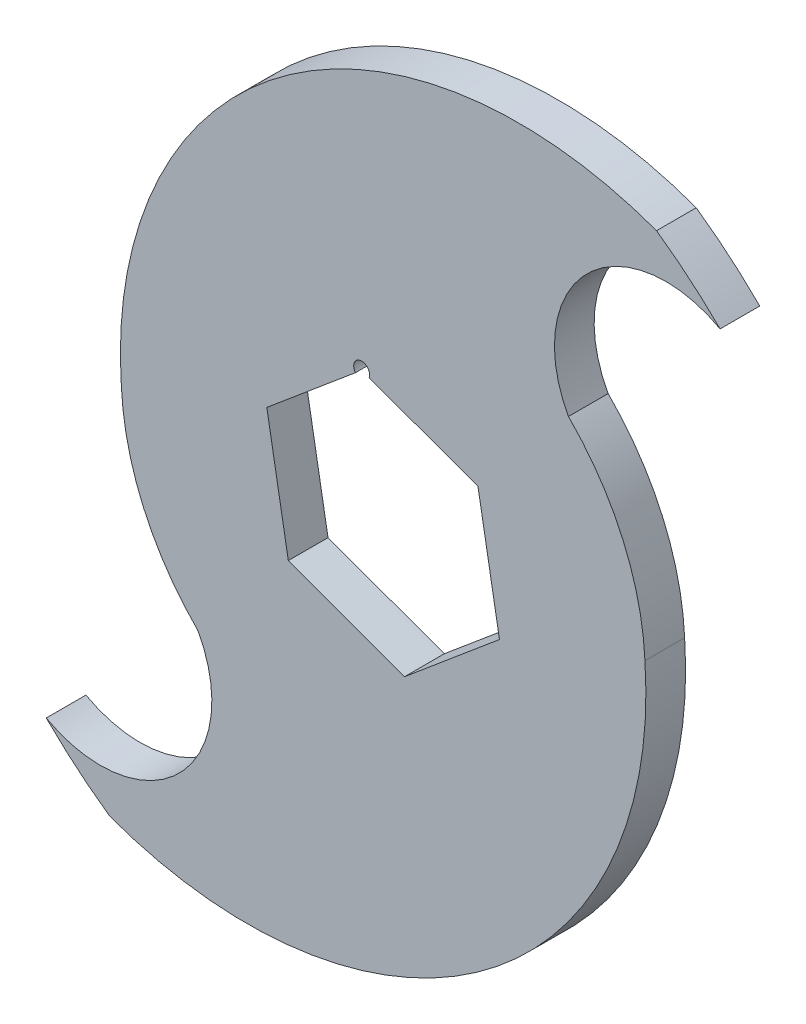
ISO-10303-21;
HEADER;
FILE_DESCRIPTION(('STEP AP214'),'2;1');
FILE_NAME('part.step','',(''),(''),'','','');
FILE_SCHEMA(('AUTOMOTIVE_DESIGN { 1 0 10303 214 1 1 1 1 }'));
ENDSEC;
DATA;
#1=APPLICATION_CONTEXT('core data for automotive mechanical design processes');
#2=APPLICATION_PROTOCOL_DEFINITION('international standard','automotive_design',2000,#1);
#3=PRODUCT_CONTEXT('',#1,'mechanical');
#4=PRODUCT('Part','Part','',(#3));
#5=PRODUCT_RELATED_PRODUCT_CATEGORY('part','',(#4));
#6=PRODUCT_DEFINITION_FORMATION('','',#4);
#7=PRODUCT_DEFINITION_CONTEXT('part definition',#1,'design');
#8=PRODUCT_DEFINITION('design','',#6,#7);
#9=PRODUCT_DEFINITION_SHAPE('','',#8);
#10=(LENGTH_UNIT() NAMED_UNIT(*) SI_UNIT(.MILLI.,.METRE.));
#11=(NAMED_UNIT(*) PLANE_ANGLE_UNIT() SI_UNIT($,.RADIAN.));
#12=(NAMED_UNIT(*) SI_UNIT($,.STERADIAN.) SOLID_ANGLE_UNIT());
#13=UNCERTAINTY_MEASURE_WITH_UNIT(LENGTH_MEASURE(1.E-05),#10,'distance_accuracy_value','');
#14=(GEOMETRIC_REPRESENTATION_CONTEXT(3) GLOBAL_UNCERTAINTY_ASSIGNED_CONTEXT((#13)) GLOBAL_UNIT_ASSIGNED_CONTEXT((#10,
#11,#12)) REPRESENTATION_CONTEXT('',''));
#15=CARTESIAN_POINT('',(0.,0.,0.));
#16=DIRECTION('',(0.,0.,1.));
#17=DIRECTION('',(1.,0.,0.));
#18=AXIS2_PLACEMENT_3D('',#15,#16,#17);
#19=CARTESIAN_POINT('',(599.736784045173,67.0737170226562,2.5));
#20=DIRECTION('',(0.,0.,1.));
#21=DIRECTION('',(1.,0.,0.));
#22=AXIS2_PLACEMENT_3D('',#19,#20,#21);
#23=PLANE('',#22);
#24=CARTESIAN_POINT('',(591.173593132432,66.0736019880909,2.5));
#25=DIRECTION('',(0.,0.,1.));
#26=DIRECTION('',(1.,0.,0.));
#27=AXIS2_PLACEMENT_3D('',#24,#25,#26);
#28=CIRCLE('',#27,60.0000000000753);
#29=CARTESIAN_POINT('',(633.600000003709,108.500008859301,2.5));
#30=VERTEX_POINT('',#29);
#31=CARTESIAN_POINT('',(625.600029607279,115.21442485109,2.5));
#32=VERTEX_POINT('',#31);
#33=EDGE_CURVE('E198',#30,#32,#28,.T.);
#34=ORIENTED_EDGE('',*,*,#33,.T.);
#35=CARTESIAN_POINT('',(608.299974957915,68.0738320572216,2.5));
#36=DIRECTION('',(0.,0.,1.));
#37=DIRECTION('',(1.,0.,0.));
#38=AXIS2_PLACEMENT_3D('',#35,#36,#37);
#39=CIRCLE('',#38,50.2148123548051);
#40=CARTESIAN_POINT('',(558.208452339072,64.5571942376213,2.5));
#41=VERTEX_POINT('',#40);
#42=EDGE_CURVE('E201',#32,#41,#39,.T.);
#43=ORIENTED_EDGE('',*,*,#42,.T.);
#44=CARTESIAN_POINT('',(591.173593132432,66.0736019880909,2.5));
#45=DIRECTION('',(0.,0.,1.));
#46=DIRECTION('',(1.,0.,0.));
#47=AXIS2_PLACEMENT_3D('',#44,#45,#46);
#48=CIRCLE('',#47,32.9999999998743);
#49=CARTESIAN_POINT('',(567.839069353395,42.7390782089929,2.5));
#50=VERTEX_POINT('',#49);
#51=EDGE_CURVE('E204',#41,#50,#48,.T.);
#52=ORIENTED_EDGE('',*,*,#51,.T.);
#53=CARTESIAN_POINT('',(555.563663293052,35.9226011772715,2.5));
#54=DIRECTION('',(0.,0.,-1.));
#55=DIRECTION('',(1.,0.,0.));
#56=AXIS2_PLACEMENT_3D('',#53,#54,#55);
#57=CIRCLE('',#56,14.0410096884193);
#58=CARTESIAN_POINT('',(548.747186261327,23.6471951169309,2.5));
#59=VERTEX_POINT('',#58);
#60=EDGE_CURVE('E206',#50,#59,#57,.T.);
#61=ORIENTED_EDGE('',*,*,#60,.T.);
#62=CARTESIAN_POINT('',(591.173593132432,66.0736019880909,2.5));
#63=DIRECTION('',(0.,0.,1.));
#64=DIRECTION('',(1.,0.,0.));
#65=AXIS2_PLACEMENT_3D('',#62,#63,#64);
#66=CIRCLE('',#65,59.9999999999184);
#67=CARTESIAN_POINT('',(556.747156657767,16.9327791251585,2.5));
#68=VERTEX_POINT('',#67);
#69=EDGE_CURVE('E208',#59,#68,#66,.T.);
#70=ORIENTED_EDGE('',*,*,#69,.T.);
#71=CARTESIAN_POINT('',(574.04721130713,64.0733719190314,2.5));
#72=DIRECTION('',(0.,0.,1.));
#73=DIRECTION('',(1.,0.,0.));
#74=AXIS2_PLACEMENT_3D('',#71,#72,#73);
#75=CIRCLE('',#74,50.2148123548129);
#76=CARTESIAN_POINT('',(624.13873392598,67.5900097386417,2.5));
#77=VERTEX_POINT('',#76);
#78=EDGE_CURVE('E210',#68,#77,#75,.T.);
#79=ORIENTED_EDGE('',*,*,#78,.T.);
#80=CARTESIAN_POINT('',(591.173593132432,66.0736019880909,2.5));
#81=DIRECTION('',(0.,0.,1.));
#82=DIRECTION('',(1.,0.,0.));
#83=AXIS2_PLACEMENT_3D('',#80,#81,#82);
#84=CIRCLE('',#83,33.0000000000631);
#85=CARTESIAN_POINT('',(614.508116911666,89.4081257672579,2.5));
#86=VERTEX_POINT('',#85);
#87=EDGE_CURVE('E212',#77,#86,#84,.T.);
#88=ORIENTED_EDGE('',*,*,#87,.T.);
#89=CARTESIAN_POINT('',(626.783522972031,96.2246027989343,2.5));
#90=DIRECTION('',(0.,0.,-1.));
#91=DIRECTION('',(1.,0.,0.));
#92=AXIS2_PLACEMENT_3D('',#89,#90,#91);
#93=CIRCLE('',#92,14.0410096884199);
#94=EDGE_CURVE('E214',#86,#30,#93,.T.);
#95=ORIENTED_EDGE('',*,*,#94,.T.);
#96=EDGE_LOOP('',(#34,#43,#52,#61,#70,#79,#88,#95));
#97=FACE_BOUND('',#96,.T.);
#98=DIRECTION('',(-0.766044443123201,-0.642787609681507,0.));
#99=VECTOR('',#98,1.);
#100=CARTESIAN_POINT('',(587.700641492209,80.782447953545,2.5));
#101=LINE('',#100,#99);
#102=CARTESIAN_POINT('',(587.700641492209,80.782447953545,2.5));
#103=VERTEX_POINT('',#102);
#104=CARTESIAN_POINT('',(576.525234868228,71.4051683772315,2.5));
#105=VERTEX_POINT('',#104);
#106=EDGE_CURVE('E148',#103,#105,#101,.T.);
#107=ORIENTED_EDGE('',*,*,#106,.F.);
#108=CARTESIAN_POINT('',(588.466685935331,81.4252355632274,2.5));
#109=DIRECTION('',(0.,0.,1.));
#110=DIRECTION('',(1.,0.,0.));
#111=AXIS2_PLACEMENT_3D('',#108,#109,#110);
#112=CIRCLE('',#111,0.999999999999964);
#113=CARTESIAN_POINT('',(589.406378556128,81.0832154199315,2.5));
#114=VERTEX_POINT('',#113);
#115=EDGE_CURVE('E140',#114,#103,#112,.T.);
#116=ORIENTED_EDGE('',*,*,#115,.F.);
#117=DIRECTION('',(-0.939692620786026,0.342020143325345,0.));
#118=VECTOR('',#117,1.);
#119=CARTESIAN_POINT('',(603.115044199528,76.0936691742315,2.5));
#120=LINE('',#119,#118);
#121=CARTESIAN_POINT('',(603.115044199528,76.0936691742315,2.5));
#122=VERTEX_POINT('',#121);
#123=EDGE_CURVE('E171',#122,#114,#120,.T.);
#124=ORIENTED_EDGE('',*,*,#123,.F.);
#125=DIRECTION('',(-0.173648177669557,0.984807753011745,0.));
#126=VECTOR('',#125,1.);
#127=CARTESIAN_POINT('',(605.821951396828,60.7420355990315,2.5));
#128=LINE('',#127,#126);
#129=CARTESIAN_POINT('',(605.821951396828,60.7420355990315,2.5));
#130=VERTEX_POINT('',#129);
#131=EDGE_CURVE('E169',#130,#122,#128,.T.);
#132=ORIENTED_EDGE('',*,*,#131,.F.);
#133=DIRECTION('',(0.766044443122931,0.642787609681829,0.));
#134=VECTOR('',#133,1.);
#135=CARTESIAN_POINT('',(593.880500329728,50.7219684130315,2.5));
#136=LINE('',#135,#134);
#137=CARTESIAN_POINT('',(593.880500329728,50.7219684130315,2.5));
#138=VERTEX_POINT('',#137);
#139=EDGE_CURVE('E167',#138,#130,#136,.T.);
#140=ORIENTED_EDGE('',*,*,#139,.F.);
#141=DIRECTION('',(0.939692620786654,-0.34202014332362,0.));
#142=VECTOR('',#141,1.);
#143=CARTESIAN_POINT('',(579.232142065528,56.0535348020315,2.5));
#144=LINE('',#143,#142);
#145=CARTESIAN_POINT('',(579.232142065528,56.0535348020315,2.5));
#146=VERTEX_POINT('',#145);
#147=EDGE_CURVE('E163',#146,#138,#144,.T.);
#148=ORIENTED_EDGE('',*,*,#147,.F.);
#149=DIRECTION('',(0.173648177669557,-0.984807753011745,0.));
#150=VECTOR('',#149,1.);
#151=CARTESIAN_POINT('',(576.525234868228,71.4051683772315,2.5));
#152=LINE('',#151,#150);
#153=EDGE_CURVE('E161',#105,#146,#152,.T.);
#154=ORIENTED_EDGE('',*,*,#153,.F.);
#155=EDGE_LOOP('',(#107,#116,#124,#132,#140,#148,#154));
#156=FACE_BOUND('',#155,.T.);
#157=ADVANCED_FACE('F33',(#97,#156),#23,.T.);
#158=CARTESIAN_POINT('',(599.736784045173,67.0737170226562,-2.5));
#159=DIRECTION('',(0.,0.,1.));
#160=DIRECTION('',(1.,0.,0.));
#161=AXIS2_PLACEMENT_3D('',#158,#159,#160);
#162=PLANE('',#161);
#163=CARTESIAN_POINT('',(591.173593132432,66.0736019880909,-2.5));
#164=DIRECTION('',(0.,0.,1.));
#165=DIRECTION('',(1.,0.,0.));
#166=AXIS2_PLACEMENT_3D('',#163,#164,#165);
#167=CIRCLE('',#166,60.0000000000753);
#168=CARTESIAN_POINT('',(633.600000003709,108.500008859301,-2.5));
#169=VERTEX_POINT('',#168);
#170=CARTESIAN_POINT('',(625.600029607279,115.21442485109,-2.5));
#171=VERTEX_POINT('',#170);
#172=EDGE_CURVE('E156',#169,#171,#167,.T.);
#173=ORIENTED_EDGE('',*,*,#172,.F.);
#174=CARTESIAN_POINT('',(626.783522972031,96.2246027989343,-2.5));
#175=DIRECTION('',(0.,0.,-1.));
#176=DIRECTION('',(1.,0.,0.));
#177=AXIS2_PLACEMENT_3D('',#174,#175,#176);
#178=CIRCLE('',#177,14.0410096884199);
#179=CARTESIAN_POINT('',(614.508116911666,89.4081257672579,-2.5));
#180=VERTEX_POINT('',#179);
#181=EDGE_CURVE('E202',#180,#169,#178,.T.);
#182=ORIENTED_EDGE('',*,*,#181,.F.);
#183=CARTESIAN_POINT('',(591.173593132432,66.0736019880909,-2.5));
#184=DIRECTION('',(0.,0.,1.));
#185=DIRECTION('',(1.,0.,0.));
#186=AXIS2_PLACEMENT_3D('',#183,#184,#185);
#187=CIRCLE('',#186,33.0000000000631);
#188=CARTESIAN_POINT('',(624.13873392598,67.5900097386417,-2.5));
#189=VERTEX_POINT('',#188);
#190=EDGE_CURVE('E229',#189,#180,#187,.T.);
#191=ORIENTED_EDGE('',*,*,#190,.F.);
#192=CARTESIAN_POINT('',(574.04721130713,64.0733719190314,-2.5));
#193=DIRECTION('',(0.,0.,1.));
#194=DIRECTION('',(1.,0.,0.));
#195=AXIS2_PLACEMENT_3D('',#192,#193,#194);
#196=CIRCLE('',#195,50.2148123548129);
#197=CARTESIAN_POINT('',(556.747156657767,16.9327791251585,-2.5));
#198=VERTEX_POINT('',#197);
#199=EDGE_CURVE('E227',#198,#189,#196,.T.);
#200=ORIENTED_EDGE('',*,*,#199,.F.);
#201=CARTESIAN_POINT('',(591.173593132432,66.0736019880909,-2.5));
#202=DIRECTION('',(0.,0.,1.));
#203=DIRECTION('',(1.,0.,0.));
#204=AXIS2_PLACEMENT_3D('',#201,#202,#203);
#205=CIRCLE('',#204,59.9999999999184);
#206=CARTESIAN_POINT('',(548.747186261327,23.6471951169309,-2.5));
#207=VERTEX_POINT('',#206);
#208=EDGE_CURVE('E225',#207,#198,#205,.T.);
#209=ORIENTED_EDGE('',*,*,#208,.F.);
#210=CARTESIAN_POINT('',(555.563663293052,35.9226011772715,-2.5));
#211=DIRECTION('',(0.,0.,-1.));
#212=DIRECTION('',(1.,0.,0.));
#213=AXIS2_PLACEMENT_3D('',#210,#211,#212);
#214=CIRCLE('',#213,14.0410096884193);
#215=CARTESIAN_POINT('',(567.839069353395,42.7390782089929,-2.5));
#216=VERTEX_POINT('',#215);
#217=EDGE_CURVE('E223',#216,#207,#214,.T.);
#218=ORIENTED_EDGE('',*,*,#217,.F.);
#219=CARTESIAN_POINT('',(591.173593132432,66.0736019880909,-2.5));
#220=DIRECTION('',(0.,0.,1.));
#221=DIRECTION('',(1.,0.,0.));
#222=AXIS2_PLACEMENT_3D('',#219,#220,#221);
#223=CIRCLE('',#222,32.9999999998743);
#224=CARTESIAN_POINT('',(558.208452339072,64.5571942376213,-2.5));
#225=VERTEX_POINT('',#224);
#226=EDGE_CURVE('E221',#225,#216,#223,.T.);
#227=ORIENTED_EDGE('',*,*,#226,.F.);
#228=CARTESIAN_POINT('',(608.299974957915,68.0738320572216,-2.5));
#229=DIRECTION('',(0.,0.,1.));
#230=DIRECTION('',(1.,0.,0.));
#231=AXIS2_PLACEMENT_3D('',#228,#229,#230);
#232=CIRCLE('',#231,50.2148123548051);
#233=EDGE_CURVE('E219',#171,#225,#232,.T.);
#234=ORIENTED_EDGE('',*,*,#233,.F.);
#235=EDGE_LOOP('',(#173,#182,#191,#200,#209,#218,#227,#234));
#236=FACE_BOUND('',#235,.T.);
#237=CARTESIAN_POINT('',(588.466685935331,81.4252355632274,-2.5));
#238=DIRECTION('',(0.,0.,1.));
#239=DIRECTION('',(1.,0.,0.));
#240=AXIS2_PLACEMENT_3D('',#237,#238,#239);
#241=CIRCLE('',#240,0.999999999999964);
#242=CARTESIAN_POINT('',(589.406378556128,81.0832154199315,-2.5));
#243=VERTEX_POINT('',#242);
#244=CARTESIAN_POINT('',(587.700641492209,80.782447953545,-2.5));
#245=VERTEX_POINT('',#244);
#246=EDGE_CURVE('E56',#243,#245,#241,.T.);
#247=ORIENTED_EDGE('',*,*,#246,.T.);
#248=DIRECTION('',(-0.766044443123201,-0.642787609681507,0.));
#249=VECTOR('',#248,1.);
#250=CARTESIAN_POINT('',(587.700641492209,80.782447953545,-2.5));
#251=LINE('',#250,#249);
#252=CARTESIAN_POINT('',(576.525234868228,71.4051683772315,-2.5));
#253=VERTEX_POINT('',#252);
#254=EDGE_CURVE('E155',#245,#253,#251,.T.);
#255=ORIENTED_EDGE('',*,*,#254,.T.);
#256=DIRECTION('',(0.173648177669557,-0.984807753011745,0.));
#257=VECTOR('',#256,1.);
#258=CARTESIAN_POINT('',(576.525234868228,71.4051683772315,-2.5));
#259=LINE('',#258,#257);
#260=CARTESIAN_POINT('',(579.232142065528,56.0535348020315,-2.5));
#261=VERTEX_POINT('',#260);
#262=EDGE_CURVE('E175',#253,#261,#259,.T.);
#263=ORIENTED_EDGE('',*,*,#262,.T.);
#264=DIRECTION('',(0.939692620786654,-0.34202014332362,0.));
#265=VECTOR('',#264,1.);
#266=CARTESIAN_POINT('',(579.232142065528,56.0535348020315,-2.5));
#267=LINE('',#266,#265);
#268=CARTESIAN_POINT('',(593.880500329728,50.7219684130315,-2.5));
#269=VERTEX_POINT('',#268);
#270=EDGE_CURVE('E178',#261,#269,#267,.T.);
#271=ORIENTED_EDGE('',*,*,#270,.T.);
#272=DIRECTION('',(0.766044443122931,0.642787609681829,0.));
#273=VECTOR('',#272,1.);
#274=CARTESIAN_POINT('',(593.880500329728,50.7219684130315,-2.5));
#275=LINE('',#274,#273);
#276=CARTESIAN_POINT('',(605.821951396828,60.7420355990315,-2.5));
#277=VERTEX_POINT('',#276);
#278=EDGE_CURVE('E181',#269,#277,#275,.T.);
#279=ORIENTED_EDGE('',*,*,#278,.T.);
#280=DIRECTION('',(-0.173648177669557,0.984807753011745,0.));
#281=VECTOR('',#280,1.);
#282=CARTESIAN_POINT('',(605.821951396828,60.7420355990315,-2.5));
#283=LINE('',#282,#281);
#284=CARTESIAN_POINT('',(603.115044199528,76.0936691742315,-2.5));
#285=VERTEX_POINT('',#284);
#286=EDGE_CURVE('E184',#277,#285,#283,.T.);
#287=ORIENTED_EDGE('',*,*,#286,.T.);
#288=DIRECTION('',(-0.939692620786026,0.342020143325345,0.));
#289=VECTOR('',#288,1.);
#290=CARTESIAN_POINT('',(603.115044199528,76.0936691742315,-2.5));
#291=LINE('',#290,#289);
#292=EDGE_CURVE('E149',#285,#243,#291,.T.);
#293=ORIENTED_EDGE('',*,*,#292,.T.);
#294=EDGE_LOOP('',(#247,#255,#263,#271,#279,#287,#293));
#295=FACE_BOUND('',#294,.T.);
#296=ADVANCED_FACE('F259',(#236,#295),#162,.F.);
#297=CARTESIAN_POINT('',(591.173593132432,66.0736019880909,2.5));
#298=DIRECTION('',(0.,0.,-1.));
#299=DIRECTION('',(-1.,0.,0.));
#300=AXIS2_PLACEMENT_3D('',#297,#298,#299);
#301=CYLINDRICAL_SURFACE('',#300,60.0000000000753);
#302=ORIENTED_EDGE('',*,*,#172,.T.);
#303=DIRECTION('',(0.,0.,-1.));
#304=VECTOR('',#303,1.);
#305=CARTESIAN_POINT('',(625.600029607279,115.21442485109,2.5));
#306=LINE('',#305,#304);
#307=EDGE_CURVE('E11',#32,#171,#306,.T.);
#308=ORIENTED_EDGE('',*,*,#307,.F.);
#309=ORIENTED_EDGE('',*,*,#33,.F.);
#310=DIRECTION('',(0.,0.,-1.));
#311=VECTOR('',#310,1.);
#312=CARTESIAN_POINT('',(633.600000003709,108.500008859301,2.5));
#313=LINE('',#312,#311);
#314=EDGE_CURVE('E216',#30,#169,#313,.T.);
#315=ORIENTED_EDGE('',*,*,#314,.T.);
#316=EDGE_LOOP('',(#302,#308,#309,#315));
#317=FACE_BOUND('',#316,.T.);
#318=ADVANCED_FACE('F35',(#317),#301,.T.);
#319=CARTESIAN_POINT('',(608.299974957915,68.0738320572216,2.5));
#320=DIRECTION('',(0.,0.,-1.));
#321=DIRECTION('',(-1.,0.,0.));
#322=AXIS2_PLACEMENT_3D('',#319,#320,#321);
#323=CYLINDRICAL_SURFACE('',#322,50.2148123548051);
#324=ORIENTED_EDGE('',*,*,#233,.T.);
#325=DIRECTION('',(0.,0.,-1.));
#326=VECTOR('',#325,1.);
#327=CARTESIAN_POINT('',(558.208452339072,64.5571942376213,2.5));
#328=LINE('',#327,#326);
#329=EDGE_CURVE('E41',#41,#225,#328,.T.);
#330=ORIENTED_EDGE('',*,*,#329,.F.);
#331=ORIENTED_EDGE('',*,*,#42,.F.);
#332=ORIENTED_EDGE('',*,*,#307,.T.);
#333=EDGE_LOOP('',(#324,#330,#331,#332));
#334=FACE_BOUND('',#333,.T.);
#335=ADVANCED_FACE('F276',(#334),#323,.T.);
#336=CARTESIAN_POINT('',(591.173593132432,66.0736019880909,2.5));
#337=DIRECTION('',(0.,0.,-1.));
#338=DIRECTION('',(-1.,0.,0.));
#339=AXIS2_PLACEMENT_3D('',#336,#337,#338);
#340=CYLINDRICAL_SURFACE('',#339,32.9999999998743);
#341=ORIENTED_EDGE('',*,*,#226,.T.);
#342=DIRECTION('',(0.,0.,-1.));
#343=VECTOR('',#342,1.);
#344=CARTESIAN_POINT('',(567.839069353395,42.7390782089929,2.5));
#345=LINE('',#344,#343);
#346=EDGE_CURVE('E246',#50,#216,#345,.T.);
#347=ORIENTED_EDGE('',*,*,#346,.F.);
#348=ORIENTED_EDGE('',*,*,#51,.F.);
#349=ORIENTED_EDGE('',*,*,#329,.T.);
#350=EDGE_LOOP('',(#341,#347,#348,#349));
#351=FACE_BOUND('',#350,.T.);
#352=ADVANCED_FACE('F253',(#351),#340,.T.);
#353=CARTESIAN_POINT('',(555.563663293052,35.9226011772715,2.5));
#354=DIRECTION('',(0.,0.,-1.));
#355=DIRECTION('',(-1.,0.,0.));
#356=AXIS2_PLACEMENT_3D('',#353,#354,#355);
#357=CYLINDRICAL_SURFACE('',#356,14.0410096884193);
#358=ORIENTED_EDGE('',*,*,#217,.T.);
#359=DIRECTION('',(0.,0.,-1.));
#360=VECTOR('',#359,1.);
#361=CARTESIAN_POINT('',(548.747186261327,23.6471951169309,2.5));
#362=LINE('',#361,#360);
#363=EDGE_CURVE('E243',#59,#207,#362,.T.);
#364=ORIENTED_EDGE('',*,*,#363,.F.);
#365=ORIENTED_EDGE('',*,*,#60,.F.);
#366=ORIENTED_EDGE('',*,*,#346,.T.);
#367=EDGE_LOOP('',(#358,#364,#365,#366));
#368=FACE_BOUND('',#367,.T.);
#369=ADVANCED_FACE('F265',(#368),#357,.F.);
#370=CARTESIAN_POINT('',(591.173593132432,66.0736019880909,2.5));
#371=DIRECTION('',(0.,0.,-1.));
#372=DIRECTION('',(-1.,0.,0.));
#373=AXIS2_PLACEMENT_3D('',#370,#371,#372);
#374=CYLINDRICAL_SURFACE('',#373,59.9999999999184);
#375=ORIENTED_EDGE('',*,*,#208,.T.);
#376=DIRECTION('',(0.,0.,-1.));
#377=VECTOR('',#376,1.);
#378=CARTESIAN_POINT('',(556.747156657767,16.9327791251585,2.5));
#379=LINE('',#378,#377);
#380=EDGE_CURVE('E240',#68,#198,#379,.T.);
#381=ORIENTED_EDGE('',*,*,#380,.F.);
#382=ORIENTED_EDGE('',*,*,#69,.F.);
#383=ORIENTED_EDGE('',*,*,#363,.T.);
#384=EDGE_LOOP('',(#375,#381,#382,#383));
#385=FACE_BOUND('',#384,.T.);
#386=ADVANCED_FACE('F269',(#385),#374,.T.);
#387=CARTESIAN_POINT('',(574.04721130713,64.0733719190314,2.5));
#388=DIRECTION('',(0.,0.,-1.));
#389=DIRECTION('',(-1.,0.,0.));
#390=AXIS2_PLACEMENT_3D('',#387,#388,#389);
#391=CYLINDRICAL_SURFACE('',#390,50.2148123548129);
#392=ORIENTED_EDGE('',*,*,#199,.T.);
#393=DIRECTION('',(0.,0.,-1.));
#394=VECTOR('',#393,1.);
#395=CARTESIAN_POINT('',(624.13873392598,67.5900097386417,2.5));
#396=LINE('',#395,#394);
#397=EDGE_CURVE('E237',#77,#189,#396,.T.);
#398=ORIENTED_EDGE('',*,*,#397,.F.);
#399=ORIENTED_EDGE('',*,*,#78,.F.);
#400=ORIENTED_EDGE('',*,*,#380,.T.);
#401=EDGE_LOOP('',(#392,#398,#399,#400));
#402=FACE_BOUND('',#401,.T.);
#403=ADVANCED_FACE('F289',(#402),#391,.T.);
#404=CARTESIAN_POINT('',(591.173593132432,66.0736019880909,2.5));
#405=DIRECTION('',(0.,0.,-1.));
#406=DIRECTION('',(-1.,0.,0.));
#407=AXIS2_PLACEMENT_3D('',#404,#405,#406);
#408=CYLINDRICAL_SURFACE('',#407,33.0000000000631);
#409=ORIENTED_EDGE('',*,*,#190,.T.);
#410=DIRECTION('',(0.,0.,-1.));
#411=VECTOR('',#410,1.);
#412=CARTESIAN_POINT('',(614.508116911666,89.4081257672579,2.5));
#413=LINE('',#412,#411);
#414=EDGE_CURVE('E234',#86,#180,#413,.T.);
#415=ORIENTED_EDGE('',*,*,#414,.F.);
#416=ORIENTED_EDGE('',*,*,#87,.F.);
#417=ORIENTED_EDGE('',*,*,#397,.T.);
#418=EDGE_LOOP('',(#409,#415,#416,#417));
#419=FACE_BOUND('',#418,.T.);
#420=ADVANCED_FACE('F287',(#419),#408,.T.);
#421=CARTESIAN_POINT('',(626.783522972031,96.2246027989343,2.5));
#422=DIRECTION('',(0.,0.,-1.));
#423=DIRECTION('',(-1.,0.,0.));
#424=AXIS2_PLACEMENT_3D('',#421,#422,#423);
#425=CYLINDRICAL_SURFACE('',#424,14.0410096884199);
#426=ORIENTED_EDGE('',*,*,#181,.T.);
#427=ORIENTED_EDGE('',*,*,#314,.F.);
#428=ORIENTED_EDGE('',*,*,#94,.F.);
#429=ORIENTED_EDGE('',*,*,#414,.T.);
#430=EDGE_LOOP('',(#426,#427,#428,#429));
#431=FACE_BOUND('',#430,.T.);
#432=ADVANCED_FACE('F282',(#431),#425,.F.);
#433=CARTESIAN_POINT('',(588.466685935331,81.4252355632274,2.5));
#434=DIRECTION('',(0.,0.,-1.));
#435=DIRECTION('',(-1.,0.,0.));
#436=AXIS2_PLACEMENT_3D('',#433,#434,#435);
#437=CYLINDRICAL_SURFACE('',#436,0.999999999999964);
#438=ORIENTED_EDGE('',*,*,#246,.F.);
#439=DIRECTION('',(0.,0.,-1.));
#440=VECTOR('',#439,1.);
#441=CARTESIAN_POINT('',(589.406378556128,81.0832154199315,2.5));
#442=LINE('',#441,#440);
#443=EDGE_CURVE('E144',#114,#243,#442,.T.);
#444=ORIENTED_EDGE('',*,*,#443,.F.);
#445=ORIENTED_EDGE('',*,*,#115,.T.);
#446=DIRECTION('',(0.,0.,-1.));
#447=VECTOR('',#446,1.);
#448=CARTESIAN_POINT('',(587.700641492209,80.782447953545,2.5));
#449=LINE('',#448,#447);
#450=EDGE_CURVE('E143',#103,#245,#449,.T.);
#451=ORIENTED_EDGE('',*,*,#450,.T.);
#452=EDGE_LOOP('',(#438,#444,#445,#451));
#453=FACE_BOUND('',#452,.T.);
#454=ADVANCED_FACE('F142',(#453),#437,.F.);
#455=CARTESIAN_POINT('',(587.700641492209,80.782447953545,2.5));
#456=DIRECTION('',(0.642787609681507,-0.766044443123201,0.));
#457=DIRECTION('',(0.766044443123201,0.642787609681507,0.));
#458=AXIS2_PLACEMENT_3D('',#455,#456,#457);
#459=PLANE('',#458);
#460=ORIENTED_EDGE('',*,*,#254,.F.);
#461=ORIENTED_EDGE('',*,*,#450,.F.);
#462=ORIENTED_EDGE('',*,*,#106,.T.);
#463=DIRECTION('',(0.,0.,-1.));
#464=VECTOR('',#463,1.);
#465=CARTESIAN_POINT('',(576.525234868228,71.4051683772315,2.5));
#466=LINE('',#465,#464);
#467=EDGE_CURVE('E157',#105,#253,#466,.T.);
#468=ORIENTED_EDGE('',*,*,#467,.T.);
#469=EDGE_LOOP('',(#460,#461,#462,#468));
#470=FACE_BOUND('',#469,.T.);
#471=ADVANCED_FACE('F152',(#470),#459,.T.);
#472=CARTESIAN_POINT('',(576.525234868228,71.4051683772315,2.5));
#473=DIRECTION('',(0.984807753011745,0.173648177669557,0.));
#474=DIRECTION('',(-0.173648177669557,0.984807753011745,0.));
#475=AXIS2_PLACEMENT_3D('',#472,#473,#474);
#476=PLANE('',#475);
#477=ORIENTED_EDGE('',*,*,#262,.F.);
#478=ORIENTED_EDGE('',*,*,#467,.F.);
#479=ORIENTED_EDGE('',*,*,#153,.T.);
#480=DIRECTION('',(0.,0.,-1.));
#481=VECTOR('',#480,1.);
#482=CARTESIAN_POINT('',(579.232142065528,56.0535348020315,2.5));
#483=LINE('',#482,#481);
#484=EDGE_CURVE('E195',#146,#261,#483,.T.);
#485=ORIENTED_EDGE('',*,*,#484,.T.);
#486=EDGE_LOOP('',(#477,#478,#479,#485));
#487=FACE_BOUND('',#486,.T.);
#488=ADVANCED_FACE('F314',(#487),#476,.T.);
#489=CARTESIAN_POINT('',(579.232142065528,56.0535348020315,2.5));
#490=DIRECTION('',(0.34202014332362,0.939692620786654,0.));
#491=DIRECTION('',(-0.939692620786654,0.34202014332362,0.));
#492=AXIS2_PLACEMENT_3D('',#489,#490,#491);
#493=PLANE('',#492);
#494=ORIENTED_EDGE('',*,*,#270,.F.);
#495=ORIENTED_EDGE('',*,*,#484,.F.);
#496=ORIENTED_EDGE('',*,*,#147,.T.);
#497=DIRECTION('',(0.,0.,-1.));
#498=VECTOR('',#497,1.);
#499=CARTESIAN_POINT('',(593.880500329728,50.7219684130315,2.5));
#500=LINE('',#499,#498);
#501=EDGE_CURVE('E193',#138,#269,#500,.T.);
#502=ORIENTED_EDGE('',*,*,#501,.T.);
#503=EDGE_LOOP('',(#494,#495,#496,#502));
#504=FACE_BOUND('',#503,.T.);
#505=ADVANCED_FACE('F318',(#504),#493,.T.);
#506=CARTESIAN_POINT('',(593.880500329728,50.7219684130315,2.5));
#507=DIRECTION('',(-0.642787609681829,0.766044443122931,0.));
#508=DIRECTION('',(-0.766044443122931,-0.642787609681829,0.));
#509=AXIS2_PLACEMENT_3D('',#506,#507,#508);
#510=PLANE('',#509);
#511=ORIENTED_EDGE('',*,*,#278,.F.);
#512=ORIENTED_EDGE('',*,*,#501,.F.);
#513=ORIENTED_EDGE('',*,*,#139,.T.);
#514=DIRECTION('',(0.,0.,-1.));
#515=VECTOR('',#514,1.);
#516=CARTESIAN_POINT('',(605.821951396828,60.7420355990315,2.5));
#517=LINE('',#516,#515);
#518=EDGE_CURVE('E191',#130,#277,#517,.T.);
#519=ORIENTED_EDGE('',*,*,#518,.T.);
#520=EDGE_LOOP('',(#511,#512,#513,#519));
#521=FACE_BOUND('',#520,.T.);
#522=ADVANCED_FACE('F324',(#521),#510,.T.);
#523=CARTESIAN_POINT('',(605.821951396828,60.7420355990315,2.5));
#524=DIRECTION('',(-0.984807753011745,-0.173648177669557,0.));
#525=DIRECTION('',(0.173648177669557,-0.984807753011745,0.));
#526=AXIS2_PLACEMENT_3D('',#523,#524,#525);
#527=PLANE('',#526);
#528=ORIENTED_EDGE('',*,*,#286,.F.);
#529=ORIENTED_EDGE('',*,*,#518,.F.);
#530=ORIENTED_EDGE('',*,*,#131,.T.);
#531=DIRECTION('',(0.,0.,-1.));
#532=VECTOR('',#531,1.);
#533=CARTESIAN_POINT('',(603.115044199528,76.0936691742315,2.5));
#534=LINE('',#533,#532);
#535=EDGE_CURVE('E48',#122,#285,#534,.T.);
#536=ORIENTED_EDGE('',*,*,#535,.T.);
#537=EDGE_LOOP('',(#528,#529,#530,#536));
#538=FACE_BOUND('',#537,.T.);
#539=ADVANCED_FACE('F328',(#538),#527,.T.);
#540=CARTESIAN_POINT('',(603.115044199528,76.0936691742315,2.5));
#541=DIRECTION('',(-0.342020143325345,-0.939692620786026,0.));
#542=DIRECTION('',(0.939692620786026,-0.342020143325345,0.));
#543=AXIS2_PLACEMENT_3D('',#540,#541,#542);
#544=PLANE('',#543);
#545=ORIENTED_EDGE('',*,*,#292,.F.);
#546=ORIENTED_EDGE('',*,*,#535,.F.);
#547=ORIENTED_EDGE('',*,*,#123,.T.);
#548=ORIENTED_EDGE('',*,*,#443,.T.);
#549=EDGE_LOOP('',(#545,#546,#547,#548));
#550=FACE_BOUND('',#549,.T.);
#551=ADVANCED_FACE('F332',(#550),#544,.T.);
#552=CLOSED_SHELL('',(#157,#296,#318,#335,#352,#369,#386,#403,#420,#432,#454,#471,#488,#505,
#522,#539,#551));
#553=MANIFOLD_SOLID_BREP('B2',#552);
#554=ADVANCED_BREP_SHAPE_REPRESENTATION('',(#18,#553),#14);
#555=SHAPE_DEFINITION_REPRESENTATION(#9,#554);
ENDSEC;
END-ISO-10303-21;
